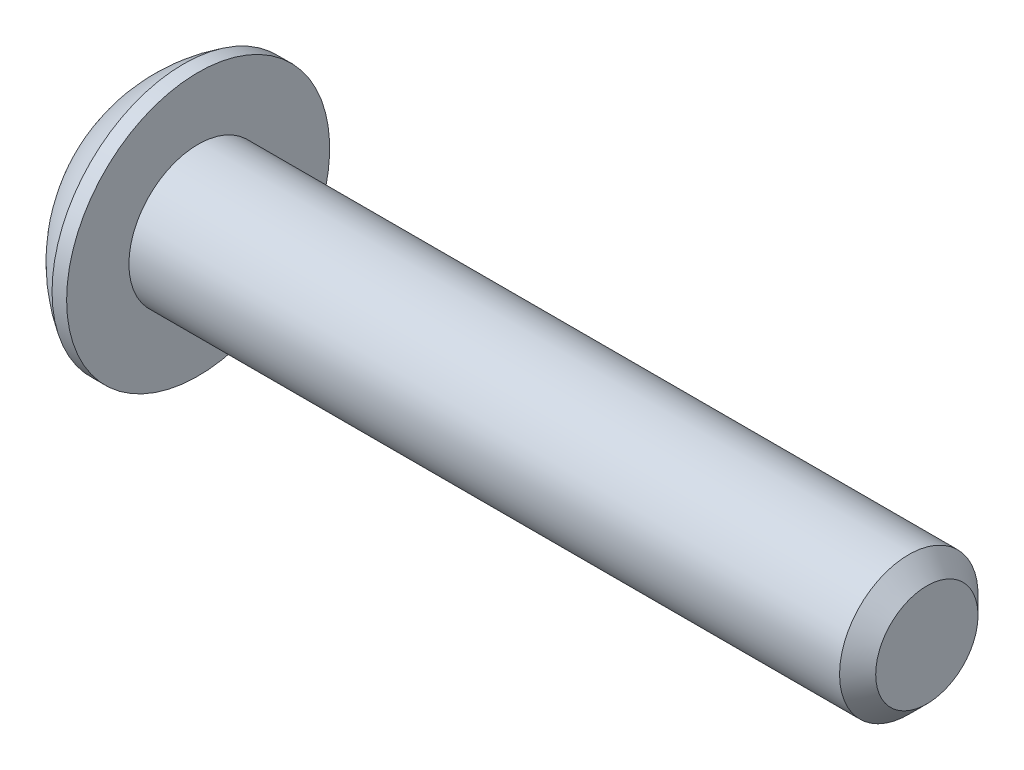
ISO-10303-21;
HEADER;
FILE_DESCRIPTION(('STEP AP214'),'2;1');
FILE_NAME('part.step','',(''),(''),'','','');
FILE_SCHEMA(('AUTOMOTIVE_DESIGN { 1 0 10303 214 1 1 1 1 }'));
ENDSEC;
DATA;
#1=APPLICATION_CONTEXT('core data for automotive mechanical design processes');
#2=APPLICATION_PROTOCOL_DEFINITION('international standard','automotive_design',2000,#1);
#3=PRODUCT_CONTEXT('',#1,'mechanical');
#4=PRODUCT('Part','Part','',(#3));
#5=PRODUCT_RELATED_PRODUCT_CATEGORY('part','',(#4));
#6=PRODUCT_DEFINITION_FORMATION('','',#4);
#7=PRODUCT_DEFINITION_CONTEXT('part definition',#1,'design');
#8=PRODUCT_DEFINITION('design','',#6,#7);
#9=PRODUCT_DEFINITION_SHAPE('','',#8);
#10=(LENGTH_UNIT() NAMED_UNIT(*) SI_UNIT(.MILLI.,.METRE.));
#11=(NAMED_UNIT(*) PLANE_ANGLE_UNIT() SI_UNIT($,.RADIAN.));
#12=(NAMED_UNIT(*) SI_UNIT($,.STERADIAN.) SOLID_ANGLE_UNIT());
#13=UNCERTAINTY_MEASURE_WITH_UNIT(LENGTH_MEASURE(1.E-05),#10,'distance_accuracy_value','');
#14=(GEOMETRIC_REPRESENTATION_CONTEXT(3) GLOBAL_UNCERTAINTY_ASSIGNED_CONTEXT((#13)) GLOBAL_UNIT_ASSIGNED_CONTEXT((#10,
#11,#12)) REPRESENTATION_CONTEXT('',''));
#15=CARTESIAN_POINT('',(0.,0.,0.));
#16=DIRECTION('',(0.,0.,1.));
#17=DIRECTION('',(1.,0.,0.));
#18=AXIS2_PLACEMENT_3D('',#15,#16,#17);
#19=CARTESIAN_POINT('',(0.,0.,0.));
#20=DIRECTION('',(-1.,0.,0.));
#21=DIRECTION('',(0.,0.,1.));
#22=AXIS2_PLACEMENT_3D('',#19,#20,#21);
#23=PLANE('',#22);
#24=CARTESIAN_POINT('',(0.,0.,0.));
#25=DIRECTION('',(-1.,0.,0.));
#26=DIRECTION('',(0.,0.,1.));
#27=AXIS2_PLACEMENT_3D('',#24,#25,#26);
#28=CIRCLE('',#27,2.29235);
#29=CARTESIAN_POINT('',(0.,2.29235,0.));
#30=VERTEX_POINT('',#29);
#31=EDGE_CURVE('E11',#30,#30,#28,.T.);
#32=ORIENTED_EDGE('',*,*,#31,.T.);
#33=EDGE_LOOP('',(#32));
#34=FACE_BOUND('',#33,.T.);
#35=DIRECTION('',(0.,-1.,0.));
#36=VECTOR('',#35,1.);
#37=CARTESIAN_POINT('',(0.,-0.916543552338529,1.5875));
#38=LINE('',#37,#36);
#39=CARTESIAN_POINT('',(0.,0.916543552338532,1.5875));
#40=VERTEX_POINT('',#39);
#41=CARTESIAN_POINT('',(0.,-0.916543552338529,1.5875));
#42=VERTEX_POINT('',#41);
#43=EDGE_CURVE('E47',#40,#42,#38,.T.);
#44=ORIENTED_EDGE('',*,*,#43,.T.);
#45=DIRECTION('',(0.,-0.5,-0.866025403784439));
#46=VECTOR('',#45,1.);
#47=CARTESIAN_POINT('',(0.,-1.83308710467706,0.));
#48=LINE('',#47,#46);
#49=CARTESIAN_POINT('',(0.,-1.83308710467706,0.));
#50=VERTEX_POINT('',#49);
#51=EDGE_CURVE('E368',#42,#50,#48,.T.);
#52=ORIENTED_EDGE('',*,*,#51,.T.);
#53=DIRECTION('',(0.,0.5,-0.866025403784439));
#54=VECTOR('',#53,1.);
#55=CARTESIAN_POINT('',(0.,-0.916543552338529,-1.5875));
#56=LINE('',#55,#54);
#57=CARTESIAN_POINT('',(0.,-0.916543552338529,-1.5875));
#58=VERTEX_POINT('',#57);
#59=EDGE_CURVE('E132',#50,#58,#56,.T.);
#60=ORIENTED_EDGE('',*,*,#59,.T.);
#61=DIRECTION('',(0.,1.,0.));
#62=VECTOR('',#61,1.);
#63=CARTESIAN_POINT('',(0.,0.916543552338532,-1.5875));
#64=LINE('',#63,#62);
#65=CARTESIAN_POINT('',(0.,0.916543552338532,-1.5875));
#66=VERTEX_POINT('',#65);
#67=EDGE_CURVE('E371',#58,#66,#64,.T.);
#68=ORIENTED_EDGE('',*,*,#67,.T.);
#69=DIRECTION('',(0.,0.5,0.866025403784439));
#70=VECTOR('',#69,1.);
#71=CARTESIAN_POINT('',(0.,1.83308710467706,0.));
#72=LINE('',#71,#70);
#73=CARTESIAN_POINT('',(0.,1.83308710467706,0.));
#74=VERTEX_POINT('',#73);
#75=EDGE_CURVE('E373',#66,#74,#72,.T.);
#76=ORIENTED_EDGE('',*,*,#75,.T.);
#77=DIRECTION('',(0.,-0.5,0.866025403784439));
#78=VECTOR('',#77,1.);
#79=CARTESIAN_POINT('',(0.,0.916543552338532,1.5875));
#80=LINE('',#79,#78);
#81=EDGE_CURVE('E375',#74,#40,#80,.T.);
#82=ORIENTED_EDGE('',*,*,#81,.T.);
#83=EDGE_LOOP('',(#44,#52,#60,#68,#76,#82));
#84=FACE_BOUND('',#83,.T.);
#85=ADVANCED_FACE('F33',(#34,#84),#23,.T.);
#86=CARTESIAN_POINT('',(4.85989606481482,0.,0.));
#87=DIRECTION('',(-1.,0.,0.));
#88=DIRECTION('',(0.,1.,0.));
#89=AXIS2_PLACEMENT_3D('',#86,#87,#88);
#90=SPHERICAL_SURFACE('',#89,5.37340285883187);
#91=CARTESIAN_POINT('',(2.0574,0.,0.));
#92=DIRECTION('',(-1.,0.,0.));
#93=DIRECTION('',(0.,0.,1.));
#94=AXIS2_PLACEMENT_3D('',#91,#92,#93);
#95=CIRCLE('',#94,4.5847);
#96=CARTESIAN_POINT('',(2.0574,4.5847,0.));
#97=VERTEX_POINT('',#96);
#98=EDGE_CURVE('E40',#97,#97,#95,.T.);
#99=CARTESIAN_POINT('',(2.0574,4.5847,0.));
#100=CARTESIAN_POINT('',(2.02963444466225,4.56772775071364,0.));
#101=CARTESIAN_POINT('',(2.00202310563314,4.55050321576171,0.));
#102=CARTESIAN_POINT('',(1.94711789153313,4.51555538986232,0.));
#103=CARTESIAN_POINT('',(1.91982401646224,4.49783209891487,0.));
#104=CARTESIAN_POINT('',(1.8655627616196,4.4618925763601,0.));
#105=CARTESIAN_POINT('',(1.83859538184787,4.44367634475277,0.));
#106=CARTESIAN_POINT('',(1.78499601309644,4.40675696303686,0.));
#107=CARTESIAN_POINT('',(1.75836402411674,4.38805381292827,0.));
#108=CARTESIAN_POINT('',(1.70544422925954,4.35016676527117,0.));
#109=CARTESIAN_POINT('',(1.67915642338203,4.33098286772266,0.));
#110=CARTESIAN_POINT('',(1.62693367141508,4.29214065809995,0.));
#111=CARTESIAN_POINT('',(1.60099872532564,4.27248234602574,0.));
#112=CARTESIAN_POINT('',(1.54949025368841,4.23269779601254,0.));
#113=CARTESIAN_POINT('',(1.52391672814064,4.21257155807355,0.));
#114=CARTESIAN_POINT('',(1.4731395388975,4.17185779967265,0.));
#115=CARTESIAN_POINT('',(1.44793587520214,4.15127027921074,0.));
#116=CARTESIAN_POINT('',(1.39790672892889,4.10964075130566,0.));
#117=CARTESIAN_POINT('',(1.37308124635099,4.08859874386249,0.));
#118=CARTESIAN_POINT('',(1.32381665673685,4.04606718757047,0.));
#119=CARTESIAN_POINT('',(1.29937754970059,4.02457763872164,0.));
#120=CARTESIAN_POINT('',(1.25089377806135,3.98115809291456,0.));
#121=CARTESIAN_POINT('',(1.22684911345837,3.95922809595632,0.));
#122=CARTESIAN_POINT('',(1.1791621633785,3.91493489261154,0.));
#123=CARTESIAN_POINT('',(1.15551987790161,3.89257168622499,0.));
#124=CARTESIAN_POINT('',(1.10864548994917,3.84741944569868,0.));
#125=CARTESIAN_POINT('',(1.08541338747362,3.82463041155892,0.));
#126=CARTESIAN_POINT('',(1.03936703400529,3.77863403775912,0.));
#127=CARTESIAN_POINT('',(1.01655278301252,3.75542669809907,0.));
#128=CARTESIAN_POINT('',(0.97134966306629,3.70860137356642,0.));
#129=CARTESIAN_POINT('',(0.94896079411283,3.68498338869381,0.));
#130=CARTESIAN_POINT('',(0.904615828391113,3.63734456959005,0.));
#131=CARTESIAN_POINT('',(0.882659731622855,3.61332373535889,0.));
#132=CARTESIAN_POINT('',(0.839187557567446,3.56488714636505,0.));
#133=CARTESIAN_POINT('',(0.817671480280295,3.54047139160237,0.));
#134=CARTESIAN_POINT('',(0.775086447240823,3.49125302072839,0.));
#135=CARTESIAN_POINT('',(0.754017491488501,3.46645040461709,0.));
#136=CARTESIAN_POINT('',(0.712333655985979,3.41646649792444,0.));
#137=CARTESIAN_POINT('',(0.691718776235777,3.39128520734308,0.));
#138=CARTESIAN_POINT('',(0.650949897322801,3.34055226358224,0.));
#139=CARTESIAN_POINT('',(0.630795898160027,3.31500061040275,0.));
#140=CARTESIAN_POINT('',(0.590955432879197,3.2635353755673,0.));
#141=CARTESIAN_POINT('',(0.571268966761141,3.23762179391134,0.));
#142=CARTESIAN_POINT('',(0.532370065703055,3.18544125571044,0.));
#143=CARTESIAN_POINT('',(0.513157630763025,3.1591742991655,0.));
#144=CARTESIAN_POINT('',(0.47521313372583,3.10629568141642,0.));
#145=CARTESIAN_POINT('',(0.456481071628664,3.07968402021228,0.));
#146=CARTESIAN_POINT('',(0.41950350337872,3.02612477715572,0.));
#147=CARTESIAN_POINT('',(0.401257997225941,2.9991771953033,0.));
#148=CARTESIAN_POINT('',(0.365259563367946,2.94495500583993,0.));
#149=CARTESIAN_POINT('',(0.34750663566273,2.91768039822897,0.));
#150=CARTESIAN_POINT('',(0.312499218594778,2.86281316009189,0.));
#151=CARTESIAN_POINT('',(0.295244729232041,2.83522052956578,0.));
#152=CARTESIAN_POINT('',(0.261239884283562,2.77972635338318,0.));
#153=CARTESIAN_POINT('',(0.24448952869782,2.7518248077267,0.));
#154=CARTESIAN_POINT('',(0.21149848009108,2.69572201115465,0.));
#155=CARTESIAN_POINT('',(0.195257787070082,2.66752076023909,0.));
#156=CARTESIAN_POINT('',(0.163291425052402,2.61082786150165,0.));
#157=CARTESIAN_POINT('',(0.147565756055718,2.58233621367976,0.));
#158=CARTESIAN_POINT('',(0.11663463018061,2.52507192700006,0.));
#159=CARTESIAN_POINT('',(0.101429173302186,2.49629928814223,0.));
#160=CARTESIAN_POINT('',(0.0715435006068005,2.43848251180434,0.));
#161=CARTESIAN_POINT('',(0.0568632847898389,2.40943837432427,0.));
#162=CARTESIAN_POINT('',(0.0280329029081004,2.35108820593535,0.));
#163=CARTESIAN_POINT('',(0.0138827368433235,2.3217821750265,0.));
#164=CARTESIAN_POINT('',(0.,2.29235,0.));
#165=B_SPLINE_CURVE_WITH_KNOTS('',3,(#99,#100,#101,#102,#103,#104,#105,#106,#107,#108,#109,#110,
#111,#112,#113,#114,#115,#116,#117,#118,#119,#120,#121,#122,#123,#124,#125,#126,#127,#128,#129,
#130,#131,#132,#133,#134,#135,#136,#137,#138,#139,#140,#141,#142,#143,#144,#145,#146,#147,#148,
#149,#150,#151,#152,#153,#154,#155,#156,#157,#158,#159,#160,#161,#162,#163,#164),.UNSPECIFIED.,
.F.,.F.,(4,2,2,2,2,2,2,2,2,2,2,2,2,2,2,2,2,2,2,2,2,2,2,2,2,2,2,2,2,2,2,2,4),(0.,
0.0976247266467795,0.195249453293558,0.292874179940339,0.390498906587118,0.488123633233898,
0.585748359880677,0.683373086527456,0.780997813174236,0.878622539821015,0.976247266467795,
1.07387199311457,1.17149671976135,1.26912144640813,1.36674617305491,1.46437089970169,
1.56199562634847,1.65962035299525,1.75724507964203,1.85486980628881,1.95249453293559,
2.05011925958237,2.14774398622915,2.24536871287593,2.34299343952271,2.44061816616948,
2.53824289281626,2.63586761946304,2.73349234610982,2.8311170727566,2.92874179940338,
3.02636652605016,3.12399125269694),.UNSPECIFIED.);
#166=EDGE_CURVE('BSEAM159',#97,#30,#165,.T.);
#167=ORIENTED_EDGE('',*,*,#98,.T.);
#168=ORIENTED_EDGE('',*,*,#31,.F.);
#169=ORIENTED_EDGE('',*,*,#166,.T.);
#170=ORIENTED_EDGE('',*,*,#166,.F.);
#171=EDGE_LOOP('',(#167,#169,#168,#170));
#172=FACE_BOUND('',#171,.T.);
#173=ADVANCED_FACE('F159',(#172),#90,.T.);
#174=CARTESIAN_POINT('',(0.,0.,0.));
#175=DIRECTION('',(-1.,0.,0.));
#176=DIRECTION('',(0.,0.,1.));
#177=AXIS2_PLACEMENT_3D('',#174,#175,#176);
#178=CYLINDRICAL_SURFACE('',#177,4.5847);
#179=ORIENTED_EDGE('',*,*,#98,.F.);
#180=EDGE_LOOP('',(#179));
#181=FACE_BOUND('',#180,.T.);
#182=CARTESIAN_POINT('',(2.5654,0.,0.));
#183=DIRECTION('',(-1.,0.,0.));
#184=DIRECTION('',(0.,0.,1.));
#185=AXIS2_PLACEMENT_3D('',#182,#183,#184);
#186=CIRCLE('',#185,4.5847);
#187=CARTESIAN_POINT('',(2.5654,0.,4.5847));
#188=VERTEX_POINT('',#187);
#189=EDGE_CURVE('E154',#188,#188,#186,.T.);
#190=ORIENTED_EDGE('',*,*,#189,.T.);
#191=EDGE_LOOP('',(#190));
#192=FACE_BOUND('',#191,.T.);
#193=ADVANCED_FACE('F162',(#181,#192),#178,.T.);
#194=CARTESIAN_POINT('',(2.5654,2.413,0.));
#195=DIRECTION('',(-1.,0.,0.));
#196=DIRECTION('',(0.,0.,1.));
#197=AXIS2_PLACEMENT_3D('',#194,#195,#196);
#198=PLANE('',#197);
#199=ORIENTED_EDGE('',*,*,#189,.F.);
#200=EDGE_LOOP('',(#199));
#201=FACE_BOUND('',#200,.T.);
#202=CARTESIAN_POINT('',(2.5654,0.,0.));
#203=DIRECTION('',(-1.,0.,0.));
#204=DIRECTION('',(0.,0.,1.));
#205=AXIS2_PLACEMENT_3D('',#202,#203,#204);
#206=CIRCLE('',#205,2.413);
#207=CARTESIAN_POINT('',(2.5654,0.,2.413));
#208=VERTEX_POINT('',#207);
#209=EDGE_CURVE('E151',#208,#208,#206,.T.);
#210=ORIENTED_EDGE('',*,*,#209,.T.);
#211=EDGE_LOOP('',(#210));
#212=FACE_BOUND('',#211,.T.);
#213=ADVANCED_FACE('F165',(#201,#212),#198,.F.);
#214=CARTESIAN_POINT('',(0.,0.,0.));
#215=DIRECTION('',(-1.,0.,0.));
#216=DIRECTION('',(0.,0.,1.));
#217=AXIS2_PLACEMENT_3D('',#214,#215,#216);
#218=CYLINDRICAL_SURFACE('',#217,2.413);
#219=ORIENTED_EDGE('',*,*,#209,.F.);
#220=EDGE_LOOP('',(#219));
#221=FACE_BOUND('',#220,.T.);
#222=CARTESIAN_POINT('',(27.33548,0.,0.));
#223=DIRECTION('',(-1.,0.,0.));
#224=DIRECTION('',(0.,0.,1.));
#225=AXIS2_PLACEMENT_3D('',#222,#223,#224);
#226=CIRCLE('',#225,2.413);
#227=CARTESIAN_POINT('',(27.33548,0.,2.413));
#228=VERTEX_POINT('',#227);
#229=EDGE_CURVE('E148',#228,#228,#226,.T.);
#230=ORIENTED_EDGE('',*,*,#229,.T.);
#231=EDGE_LOOP('',(#230));
#232=FACE_BOUND('',#231,.T.);
#233=ADVANCED_FACE('F171',(#221,#232),#218,.T.);
#234=CARTESIAN_POINT('',(27.9654,0.,0.));
#235=DIRECTION('',(-1.,0.,0.));
#236=DIRECTION('',(0.,0.,1.));
#237=AXIS2_PLACEMENT_3D('',#234,#235,#236);
#238=CONICAL_SURFACE('',#237,1.78308,0.785398163397443);
#239=ORIENTED_EDGE('',*,*,#229,.F.);
#240=EDGE_LOOP('',(#239));
#241=FACE_BOUND('',#240,.T.);
#242=CARTESIAN_POINT('',(27.9654,0.,0.));
#243=DIRECTION('',(-1.,0.,0.));
#244=DIRECTION('',(0.,0.,1.));
#245=AXIS2_PLACEMENT_3D('',#242,#243,#244);
#246=CIRCLE('',#245,1.78308);
#247=CARTESIAN_POINT('',(27.9654,0.,1.78308));
#248=VERTEX_POINT('',#247);
#249=EDGE_CURVE('E144',#248,#248,#246,.T.);
#250=ORIENTED_EDGE('',*,*,#249,.T.);
#251=EDGE_LOOP('',(#250));
#252=FACE_BOUND('',#251,.T.);
#253=ADVANCED_FACE('F177',(#241,#252),#238,.T.);
#254=CARTESIAN_POINT('',(27.9654,0.,0.));
#255=DIRECTION('',(-1.,0.,0.));
#256=DIRECTION('',(0.,0.,1.));
#257=AXIS2_PLACEMENT_3D('',#254,#255,#256);
#258=PLANE('',#257);
#259=ORIENTED_EDGE('',*,*,#249,.F.);
#260=EDGE_LOOP('',(#259));
#261=FACE_BOUND('',#260,.T.);
#262=ADVANCED_FACE('F183',(#261),#258,.F.);
#263=CARTESIAN_POINT('',(1.778,-1.83308710467706,0.));
#264=DIRECTION('',(0.,0.866025403784439,-0.5));
#265=DIRECTION('',(0.,0.5,0.866025403784439));
#266=AXIS2_PLACEMENT_3D('',#263,#264,#265);
#267=PLANE('',#266);
#268=DIRECTION('',(0.,-0.5,-0.866025403784439));
#269=VECTOR('',#268,1.);
#270=CARTESIAN_POINT('',(1.778,-1.83308710467706,0.));
#271=LINE('',#270,#269);
#272=CARTESIAN_POINT('',(1.778,-0.916543552338529,1.5875));
#273=VERTEX_POINT('',#272);
#274=CARTESIAN_POINT('',(1.778,-1.37481532850779,0.793749999999999));
#275=VERTEX_POINT('',#274);
#276=EDGE_CURVE('E115',#273,#275,#271,.T.);
#277=ORIENTED_EDGE('',*,*,#276,.T.);
#278=CARTESIAN_POINT('',(1.778,-1.83308710467706,0.));
#279=VERTEX_POINT('',#278);
#280=EDGE_CURVE('E108',#275,#279,#271,.T.);
#281=ORIENTED_EDGE('',*,*,#280,.T.);
#282=DIRECTION('',(-1.,0.,0.));
#283=VECTOR('',#282,1.);
#284=CARTESIAN_POINT('',(1.778,-1.83308710467706,0.));
#285=LINE('',#284,#283);
#286=EDGE_CURVE('E112',#279,#50,#285,.T.);
#287=ORIENTED_EDGE('',*,*,#286,.T.);
#288=ORIENTED_EDGE('',*,*,#51,.F.);
#289=DIRECTION('',(-1.,0.,0.));
#290=VECTOR('',#289,1.);
#291=CARTESIAN_POINT('',(1.778,-0.916543552338529,1.5875));
#292=LINE('',#291,#290);
#293=EDGE_CURVE('E367',#273,#42,#292,.T.);
#294=ORIENTED_EDGE('',*,*,#293,.F.);
#295=EDGE_LOOP('',(#277,#281,#287,#288,#294));
#296=FACE_BOUND('',#295,.T.);
#297=ADVANCED_FACE('F110',(#296),#267,.T.);
#298=CARTESIAN_POINT('',(1.778,-0.916543552338529,-1.5875));
#299=DIRECTION('',(0.,0.866025403784439,0.5));
#300=DIRECTION('',(0.,-0.5,0.866025403784439));
#301=AXIS2_PLACEMENT_3D('',#298,#299,#300);
#302=PLANE('',#301);
#303=DIRECTION('',(0.,0.5,-0.866025403784439));
#304=VECTOR('',#303,1.);
#305=CARTESIAN_POINT('',(1.778,-0.916543552338529,-1.5875));
#306=LINE('',#305,#304);
#307=CARTESIAN_POINT('',(1.778,-1.37481532850779,-0.793749999999999));
#308=VERTEX_POINT('',#307);
#309=EDGE_CURVE('E120',#279,#308,#306,.T.);
#310=ORIENTED_EDGE('',*,*,#309,.T.);
#311=CARTESIAN_POINT('',(1.778,-0.916543552338529,-1.5875));
#312=VERTEX_POINT('',#311);
#313=EDGE_CURVE('E127',#308,#312,#306,.T.);
#314=ORIENTED_EDGE('',*,*,#313,.T.);
#315=DIRECTION('',(-1.,0.,0.));
#316=VECTOR('',#315,1.);
#317=CARTESIAN_POINT('',(1.778,-0.916543552338529,-1.5875));
#318=LINE('',#317,#316);
#319=EDGE_CURVE('E134',#312,#58,#318,.T.);
#320=ORIENTED_EDGE('',*,*,#319,.T.);
#321=ORIENTED_EDGE('',*,*,#59,.F.);
#322=ORIENTED_EDGE('',*,*,#286,.F.);
#323=EDGE_LOOP('',(#310,#314,#320,#321,#322));
#324=FACE_BOUND('',#323,.T.);
#325=ADVANCED_FACE('F130',(#324),#302,.T.);
#326=CARTESIAN_POINT('',(1.778,0.916543552338532,-1.5875));
#327=DIRECTION('',(0.,0.,1.));
#328=DIRECTION('',(0.,-1.,0.));
#329=AXIS2_PLACEMENT_3D('',#326,#327,#328);
#330=PLANE('',#329);
#331=DIRECTION('',(0.,1.,0.));
#332=VECTOR('',#331,1.);
#333=CARTESIAN_POINT('',(1.778,0.916543552338532,-1.5875));
#334=LINE('',#333,#332);
#335=CARTESIAN_POINT('',(1.778,0.,-1.5875));
#336=VERTEX_POINT('',#335);
#337=EDGE_CURVE('E392',#312,#336,#334,.T.);
#338=ORIENTED_EDGE('',*,*,#337,.T.);
#339=CARTESIAN_POINT('',(1.778,0.916543552338532,-1.5875));
#340=VERTEX_POINT('',#339);
#341=EDGE_CURVE('E126',#336,#340,#334,.T.);
#342=ORIENTED_EDGE('',*,*,#341,.T.);
#343=DIRECTION('',(-1.,0.,0.));
#344=VECTOR('',#343,1.);
#345=CARTESIAN_POINT('',(1.778,0.916543552338532,-1.5875));
#346=LINE('',#345,#344);
#347=EDGE_CURVE('E139',#340,#66,#346,.T.);
#348=ORIENTED_EDGE('',*,*,#347,.T.);
#349=ORIENTED_EDGE('',*,*,#67,.F.);
#350=ORIENTED_EDGE('',*,*,#319,.F.);
#351=EDGE_LOOP('',(#338,#342,#348,#349,#350));
#352=FACE_BOUND('',#351,.T.);
#353=ADVANCED_FACE('F242',(#352),#330,.T.);
#354=CARTESIAN_POINT('',(1.778,1.83308710467706,0.));
#355=DIRECTION('',(0.,-0.866025403784439,0.5));
#356=DIRECTION('',(0.,-0.5,-0.866025403784439));
#357=AXIS2_PLACEMENT_3D('',#354,#355,#356);
#358=PLANE('',#357);
#359=DIRECTION('',(0.,0.5,0.866025403784439));
#360=VECTOR('',#359,1.);
#361=CARTESIAN_POINT('',(1.778,1.83308710467706,0.));
#362=LINE('',#361,#360);
#363=CARTESIAN_POINT('',(1.778,1.3748153285078,-0.793749999999999));
#364=VERTEX_POINT('',#363);
#365=EDGE_CURVE('E354',#340,#364,#362,.T.);
#366=ORIENTED_EDGE('',*,*,#365,.T.);
#367=CARTESIAN_POINT('',(1.778,1.83308710467706,0.));
#368=VERTEX_POINT('',#367);
#369=EDGE_CURVE('E394',#364,#368,#362,.T.);
#370=ORIENTED_EDGE('',*,*,#369,.T.);
#371=DIRECTION('',(-1.,0.,0.));
#372=VECTOR('',#371,1.);
#373=CARTESIAN_POINT('',(1.778,1.83308710467706,0.));
#374=LINE('',#373,#372);
#375=EDGE_CURVE('E360',#368,#74,#374,.T.);
#376=ORIENTED_EDGE('',*,*,#375,.T.);
#377=ORIENTED_EDGE('',*,*,#75,.F.);
#378=ORIENTED_EDGE('',*,*,#347,.F.);
#379=EDGE_LOOP('',(#366,#370,#376,#377,#378));
#380=FACE_BOUND('',#379,.T.);
#381=ADVANCED_FACE('F251',(#380),#358,.T.);
#382=CARTESIAN_POINT('',(1.778,0.916543552338532,1.5875));
#383=DIRECTION('',(0.,-0.866025403784439,-0.5));
#384=DIRECTION('',(0.,0.5,-0.866025403784439));
#385=AXIS2_PLACEMENT_3D('',#382,#383,#384);
#386=PLANE('',#385);
#387=DIRECTION('',(0.,-0.5,0.866025403784439));
#388=VECTOR('',#387,1.);
#389=CARTESIAN_POINT('',(1.778,0.916543552338532,1.5875));
#390=LINE('',#389,#388);
#391=CARTESIAN_POINT('',(1.778,1.3748153285078,0.793749999999999));
#392=VERTEX_POINT('',#391);
#393=EDGE_CURVE('E353',#368,#392,#390,.T.);
#394=ORIENTED_EDGE('',*,*,#393,.T.);
#395=CARTESIAN_POINT('',(1.778,0.916543552338532,1.5875));
#396=VERTEX_POINT('',#395);
#397=EDGE_CURVE('E350',#392,#396,#390,.T.);
#398=ORIENTED_EDGE('',*,*,#397,.T.);
#399=DIRECTION('',(-1.,0.,0.));
#400=VECTOR('',#399,1.);
#401=CARTESIAN_POINT('',(1.778,0.916543552338532,1.5875));
#402=LINE('',#401,#400);
#403=EDGE_CURVE('E380',#396,#40,#402,.T.);
#404=ORIENTED_EDGE('',*,*,#403,.T.);
#405=ORIENTED_EDGE('',*,*,#81,.F.);
#406=ORIENTED_EDGE('',*,*,#375,.F.);
#407=EDGE_LOOP('',(#394,#398,#404,#405,#406));
#408=FACE_BOUND('',#407,.T.);
#409=ADVANCED_FACE('F261',(#408),#386,.T.);
#410=CARTESIAN_POINT('',(1.778,-0.916543552338529,1.5875));
#411=DIRECTION('',(0.,0.,-1.));
#412=DIRECTION('',(0.,1.,0.));
#413=AXIS2_PLACEMENT_3D('',#410,#411,#412);
#414=PLANE('',#413);
#415=DIRECTION('',(0.,-1.,0.));
#416=VECTOR('',#415,1.);
#417=CARTESIAN_POINT('',(1.778,-0.916543552338529,1.5875));
#418=LINE('',#417,#416);
#419=CARTESIAN_POINT('',(1.778,0.,1.5875));
#420=VERTEX_POINT('',#419);
#421=EDGE_CURVE('E55',#396,#420,#418,.T.);
#422=ORIENTED_EDGE('',*,*,#421,.T.);
#423=EDGE_CURVE('E362',#420,#273,#418,.T.);
#424=ORIENTED_EDGE('',*,*,#423,.T.);
#425=ORIENTED_EDGE('',*,*,#293,.T.);
#426=ORIENTED_EDGE('',*,*,#43,.F.);
#427=ORIENTED_EDGE('',*,*,#403,.F.);
#428=EDGE_LOOP('',(#422,#424,#425,#426,#427));
#429=FACE_BOUND('',#428,.T.);
#430=ADVANCED_FACE('F271',(#429),#414,.T.);
#431=CARTESIAN_POINT('',(1.778,-0.916543552338529,1.5875));
#432=DIRECTION('',(-1.,0.,0.));
#433=DIRECTION('',(0.,0.,1.));
#434=AXIS2_PLACEMENT_3D('',#431,#432,#433);
#435=PLANE('',#434);
#436=ORIENTED_EDGE('',*,*,#421,.F.);
#437=ORIENTED_EDGE('',*,*,#397,.F.);
#438=CARTESIAN_POINT('',(1.778,0.,0.));
#439=DIRECTION('',(-1.,0.,0.));
#440=DIRECTION('',(0.,0.,1.));
#441=AXIS2_PLACEMENT_3D('',#438,#439,#440);
#442=CIRCLE('',#441,1.5875);
#443=EDGE_CURVE('E138',#420,#392,#442,.T.);
#444=ORIENTED_EDGE('',*,*,#443,.F.);
#445=EDGE_LOOP('',(#436,#437,#444));
#446=FACE_BOUND('',#445,.T.);
#447=ADVANCED_FACE('F281',(#446),#435,.T.);
#448=ORIENTED_EDGE('',*,*,#393,.F.);
#449=ORIENTED_EDGE('',*,*,#369,.F.);
#450=EDGE_CURVE('E145',#392,#364,#442,.T.);
#451=ORIENTED_EDGE('',*,*,#450,.F.);
#452=EDGE_LOOP('',(#448,#449,#451));
#453=FACE_BOUND('',#452,.T.);
#454=ADVANCED_FACE('F290',(#453),#435,.T.);
#455=ORIENTED_EDGE('',*,*,#365,.F.);
#456=ORIENTED_EDGE('',*,*,#341,.F.);
#457=EDGE_CURVE('E395',#364,#336,#442,.T.);
#458=ORIENTED_EDGE('',*,*,#457,.F.);
#459=EDGE_LOOP('',(#455,#456,#458));
#460=FACE_BOUND('',#459,.T.);
#461=ADVANCED_FACE('F301',(#460),#435,.T.);
#462=ORIENTED_EDGE('',*,*,#337,.F.);
#463=ORIENTED_EDGE('',*,*,#313,.F.);
#464=EDGE_CURVE('E393',#336,#308,#442,.T.);
#465=ORIENTED_EDGE('',*,*,#464,.F.);
#466=EDGE_LOOP('',(#462,#463,#465));
#467=FACE_BOUND('',#466,.T.);
#468=ADVANCED_FACE('F310',(#467),#435,.T.);
#469=ORIENTED_EDGE('',*,*,#309,.F.);
#470=ORIENTED_EDGE('',*,*,#280,.F.);
#471=EDGE_CURVE('E122',#308,#275,#442,.T.);
#472=ORIENTED_EDGE('',*,*,#471,.F.);
#473=EDGE_LOOP('',(#469,#470,#472));
#474=FACE_BOUND('',#473,.T.);
#475=ADVANCED_FACE('F121',(#474),#435,.T.);
#476=ORIENTED_EDGE('',*,*,#276,.F.);
#477=ORIENTED_EDGE('',*,*,#423,.F.);
#478=EDGE_CURVE('E133',#275,#420,#442,.T.);
#479=ORIENTED_EDGE('',*,*,#478,.F.);
#480=EDGE_LOOP('',(#476,#477,#479));
#481=FACE_BOUND('',#480,.T.);
#482=ADVANCED_FACE('F293',(#481),#435,.T.);
#483=CARTESIAN_POINT('',(2.69454355233854,0.,0.));
#484=DIRECTION('',(-1.,0.,0.));
#485=DIRECTION('',(0.,0.,1.));
#486=AXIS2_PLACEMENT_3D('',#483,#484,#485);
#487=CONICAL_SURFACE('',#486,0.,1.04719755119659);
#488=ORIENTED_EDGE('',*,*,#443,.T.);
#489=ORIENTED_EDGE('',*,*,#450,.T.);
#490=ORIENTED_EDGE('',*,*,#457,.T.);
#491=ORIENTED_EDGE('',*,*,#464,.T.);
#492=ORIENTED_EDGE('',*,*,#471,.T.);
#493=ORIENTED_EDGE('',*,*,#478,.T.);
#494=EDGE_LOOP('',(#488,#489,#490,#491,#492,#493));
#495=FACE_BOUND('',#494,.T.);
#496=CARTESIAN_POINT('',(2.69454355233854,0.,0.));
#497=VERTEX_POINT('',#496);
#498=VERTEX_LOOP('',#497);
#499=FACE_BOUND('',#498,.T.);
#500=ADVANCED_FACE('F334',(#495,#499),#487,.F.);
#501=CLOSED_SHELL('',(#85,#173,#193,#213,#233,#253,#262,#297,#325,#353,#381,#409,#430,#447,#454,
#461,#468,#475,#482,#500));
#502=MANIFOLD_SOLID_BREP('B2',#501);
#503=ADVANCED_BREP_SHAPE_REPRESENTATION('',(#18,#502),#14);
#504=SHAPE_DEFINITION_REPRESENTATION(#9,#503);
ENDSEC;
END-ISO-10303-21;
